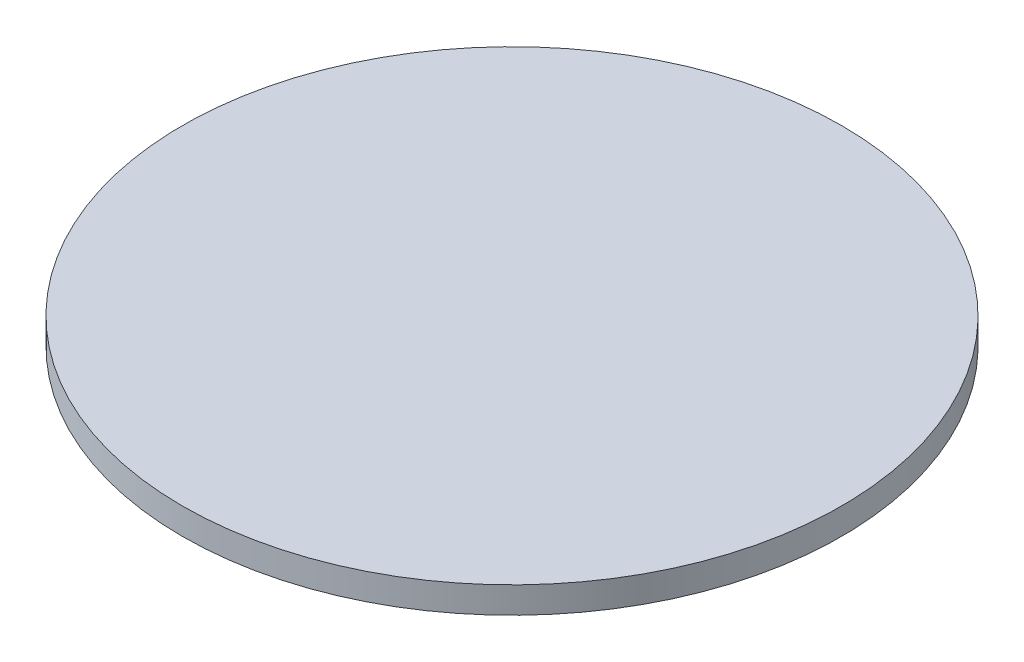
ISO-10303-21;
HEADER;
FILE_DESCRIPTION(('STEP AP214'),'2;1');
FILE_NAME('part.step','',(''),(''),'','','');
FILE_SCHEMA(('AUTOMOTIVE_DESIGN { 1 0 10303 214 1 1 1 1 }'));
ENDSEC;
DATA;
#1=APPLICATION_CONTEXT('core data for automotive mechanical design processes');
#2=APPLICATION_PROTOCOL_DEFINITION('international standard','automotive_design',2000,#1);
#3=PRODUCT_CONTEXT('',#1,'mechanical');
#4=PRODUCT('Part','Part','',(#3));
#5=PRODUCT_RELATED_PRODUCT_CATEGORY('part','',(#4));
#6=PRODUCT_DEFINITION_FORMATION('','',#4);
#7=PRODUCT_DEFINITION_CONTEXT('part definition',#1,'design');
#8=PRODUCT_DEFINITION('design','',#6,#7);
#9=PRODUCT_DEFINITION_SHAPE('','',#8);
#10=(LENGTH_UNIT() NAMED_UNIT(*) SI_UNIT(.MILLI.,.METRE.));
#11=(NAMED_UNIT(*) PLANE_ANGLE_UNIT() SI_UNIT($,.RADIAN.));
#12=(NAMED_UNIT(*) SI_UNIT($,.STERADIAN.) SOLID_ANGLE_UNIT());
#13=UNCERTAINTY_MEASURE_WITH_UNIT(LENGTH_MEASURE(1.E-05),#10,'distance_accuracy_value','');
#14=(GEOMETRIC_REPRESENTATION_CONTEXT(3) GLOBAL_UNCERTAINTY_ASSIGNED_CONTEXT((#13)) GLOBAL_UNIT_ASSIGNED_CONTEXT((#10,
#11,#12)) REPRESENTATION_CONTEXT('',''));
#15=CARTESIAN_POINT('',(0.,0.,0.));
#16=DIRECTION('',(0.,0.,1.));
#17=DIRECTION('',(1.,0.,0.));
#18=AXIS2_PLACEMENT_3D('',#15,#16,#17);
#19=CARTESIAN_POINT('',(0.,2.,0.));
#20=DIRECTION('',(0.,-1.,0.));
#21=DIRECTION('',(0.,0.,-1.));
#22=AXIS2_PLACEMENT_3D('',#19,#20,#21);
#23=CYLINDRICAL_SURFACE('',#22,25.);
#24=CARTESIAN_POINT('',(0.,2.,0.));
#25=DIRECTION('',(0.,1.,0.));
#26=DIRECTION('',(0.,0.,1.));
#27=AXIS2_PLACEMENT_3D('',#24,#25,#26);
#28=CIRCLE('',#27,25.);
#29=CARTESIAN_POINT('',(0.,2.,25.));
#30=VERTEX_POINT('',#29);
#31=EDGE_CURVE('E10',#30,#30,#28,.T.);
#32=ORIENTED_EDGE('',*,*,#31,.F.);
#33=EDGE_LOOP('',(#32));
#34=FACE_BOUND('',#33,.T.);
#35=CARTESIAN_POINT('',(0.,0.,0.));
#36=DIRECTION('',(0.,1.,0.));
#37=DIRECTION('',(0.,0.,1.));
#38=AXIS2_PLACEMENT_3D('',#35,#36,#37);
#39=CIRCLE('',#38,25.);
#40=CARTESIAN_POINT('',(0.,0.,25.));
#41=VERTEX_POINT('',#40);
#42=EDGE_CURVE('E35',#41,#41,#39,.T.);
#43=ORIENTED_EDGE('',*,*,#42,.T.);
#44=EDGE_LOOP('',(#43));
#45=FACE_BOUND('',#44,.T.);
#46=ADVANCED_FACE('F32',(#34,#45),#23,.T.);
#47=CARTESIAN_POINT('',(0.,2.,0.));
#48=DIRECTION('',(0.,1.,0.));
#49=DIRECTION('',(0.,0.,1.));
#50=AXIS2_PLACEMENT_3D('',#47,#48,#49);
#51=PLANE('',#50);
#52=ORIENTED_EDGE('',*,*,#31,.T.);
#53=EDGE_LOOP('',(#52));
#54=FACE_BOUND('',#53,.T.);
#55=ADVANCED_FACE('F47',(#54),#51,.T.);
#56=CARTESIAN_POINT('',(0.,0.,0.));
#57=DIRECTION('',(0.,1.,0.));
#58=DIRECTION('',(0.,0.,1.));
#59=AXIS2_PLACEMENT_3D('',#56,#57,#58);
#60=PLANE('',#59);
#61=ORIENTED_EDGE('',*,*,#42,.F.);
#62=EDGE_LOOP('',(#61));
#63=FACE_BOUND('',#62,.T.);
#64=ADVANCED_FACE('F45',(#63),#60,.F.);
#65=CLOSED_SHELL('',(#46,#55,#64));
#66=MANIFOLD_SOLID_BREP('B2',#65);
#67=ADVANCED_BREP_SHAPE_REPRESENTATION('',(#18,#66),#14);
#68=SHAPE_DEFINITION_REPRESENTATION(#9,#67);
ENDSEC;
END-ISO-10303-21;
